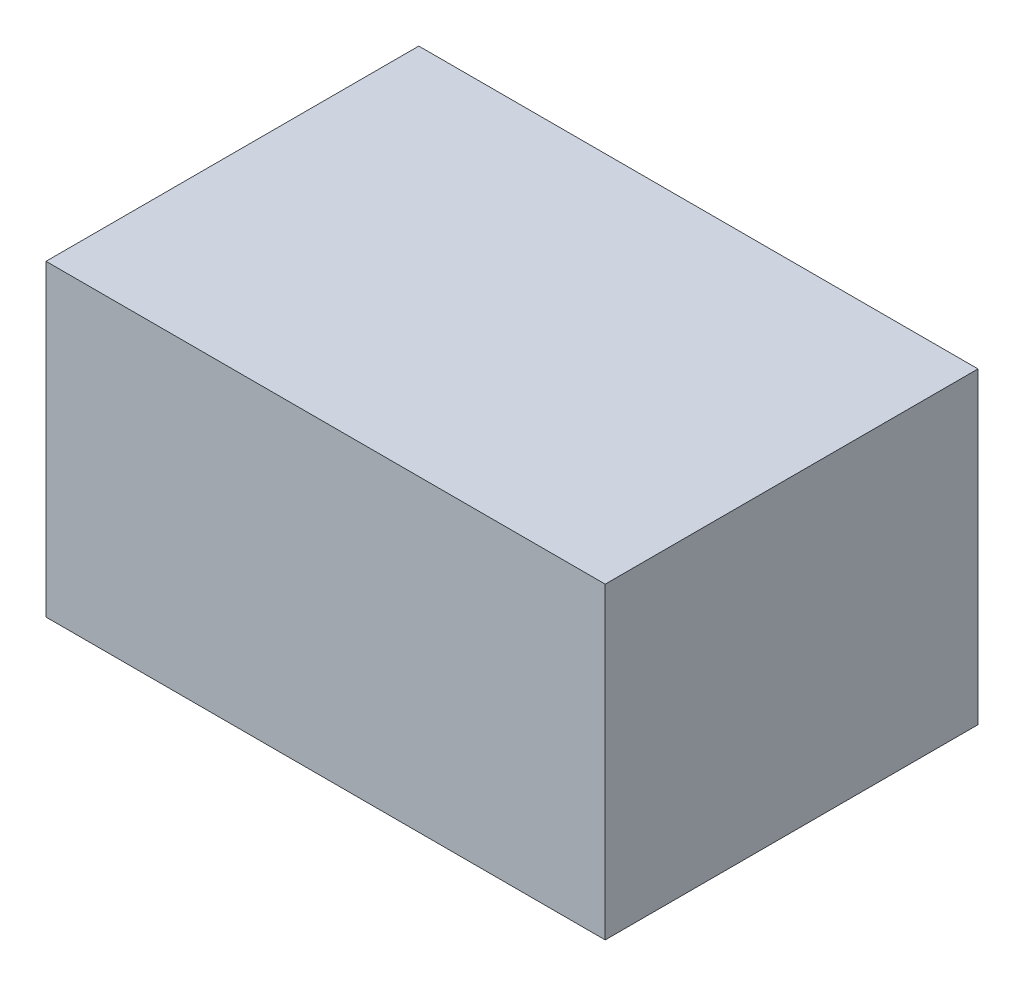
ISO-10303-21;
HEADER;
FILE_DESCRIPTION(('STEP AP214'),'2;1');
FILE_NAME('part.step','',(''),(''),'','','');
FILE_SCHEMA(('AUTOMOTIVE_DESIGN { 1 0 10303 214 1 1 1 1 }'));
ENDSEC;
DATA;
#1=APPLICATION_CONTEXT('core data for automotive mechanical design processes');
#2=APPLICATION_PROTOCOL_DEFINITION('international standard','automotive_design',2000,#1);
#3=PRODUCT_CONTEXT('',#1,'mechanical');
#4=PRODUCT('Part','Part','',(#3));
#5=PRODUCT_RELATED_PRODUCT_CATEGORY('part','',(#4));
#6=PRODUCT_DEFINITION_FORMATION('','',#4);
#7=PRODUCT_DEFINITION_CONTEXT('part definition',#1,'design');
#8=PRODUCT_DEFINITION('design','',#6,#7);
#9=PRODUCT_DEFINITION_SHAPE('','',#8);
#10=(LENGTH_UNIT() NAMED_UNIT(*) SI_UNIT(.MILLI.,.METRE.));
#11=(NAMED_UNIT(*) PLANE_ANGLE_UNIT() SI_UNIT($,.RADIAN.));
#12=(NAMED_UNIT(*) SI_UNIT($,.STERADIAN.) SOLID_ANGLE_UNIT());
#13=UNCERTAINTY_MEASURE_WITH_UNIT(LENGTH_MEASURE(1.E-05),#10,'distance_accuracy_value','');
#14=(GEOMETRIC_REPRESENTATION_CONTEXT(3) GLOBAL_UNCERTAINTY_ASSIGNED_CONTEXT((#13)) GLOBAL_UNIT_ASSIGNED_CONTEXT((#10,
#11,#12)) REPRESENTATION_CONTEXT('',''));
#15=CARTESIAN_POINT('',(0.,0.,0.));
#16=DIRECTION('',(0.,0.,1.));
#17=DIRECTION('',(1.,0.,0.));
#18=AXIS2_PLACEMENT_3D('',#15,#16,#17);
#19=CARTESIAN_POINT('',(150.,-82.6533850131725,200.));
#20=DIRECTION('',(-1.,0.,0.));
#21=DIRECTION('',(0.,0.,1.));
#22=AXIS2_PLACEMENT_3D('',#19,#20,#21);
#23=PLANE('',#22);
#24=DIRECTION('',(0.,1.,0.));
#25=VECTOR('',#24,1.);
#26=CARTESIAN_POINT('',(150.,-82.6533850131725,0.));
#27=LINE('',#26,#25);
#28=CARTESIAN_POINT('',(150.,-82.6533850131725,0.));
#29=VERTEX_POINT('',#28);
#30=CARTESIAN_POINT('',(150.,82.6533850131725,0.));
#31=VERTEX_POINT('',#30);
#32=EDGE_CURVE('E97',#29,#31,#27,.T.);
#33=ORIENTED_EDGE('',*,*,#32,.T.);
#34=DIRECTION('',(0.,0.,-1.));
#35=VECTOR('',#34,1.);
#36=CARTESIAN_POINT('',(150.,82.6533850131725,200.));
#37=LINE('',#36,#35);
#38=CARTESIAN_POINT('',(150.,82.6533850131725,200.));
#39=VERTEX_POINT('',#38);
#40=EDGE_CURVE('E11',#39,#31,#37,.T.);
#41=ORIENTED_EDGE('',*,*,#40,.F.);
#42=DIRECTION('',(0.,1.,0.));
#43=VECTOR('',#42,1.);
#44=CARTESIAN_POINT('',(150.,-82.6533850131725,200.));
#45=LINE('',#44,#43);
#46=CARTESIAN_POINT('',(150.,-82.6533850131725,200.));
#47=VERTEX_POINT('',#46);
#48=EDGE_CURVE('E85',#47,#39,#45,.T.);
#49=ORIENTED_EDGE('',*,*,#48,.F.);
#50=DIRECTION('',(0.,0.,-1.));
#51=VECTOR('',#50,1.);
#52=CARTESIAN_POINT('',(150.,-82.6533850131725,200.));
#53=LINE('',#52,#51);
#54=EDGE_CURVE('E93',#47,#29,#53,.T.);
#55=ORIENTED_EDGE('',*,*,#54,.T.);
#56=EDGE_LOOP('',(#33,#41,#49,#55));
#57=FACE_BOUND('',#56,.T.);
#58=ADVANCED_FACE('F34',(#57),#23,.F.);
#59=CARTESIAN_POINT('',(-150.,82.6533850131725,200.));
#60=DIRECTION('',(0.,-1.,0.));
#61=DIRECTION('',(0.,0.,-1.));
#62=AXIS2_PLACEMENT_3D('',#59,#60,#61);
#63=PLANE('',#62);
#64=DIRECTION('',(-1.,0.,0.));
#65=VECTOR('',#64,1.);
#66=CARTESIAN_POINT('',(-150.,82.6533850131725,0.));
#67=LINE('',#66,#65);
#68=CARTESIAN_POINT('',(-150.,82.6533850131725,0.));
#69=VERTEX_POINT('',#68);
#70=EDGE_CURVE('E89',#31,#69,#67,.T.);
#71=ORIENTED_EDGE('',*,*,#70,.T.);
#72=DIRECTION('',(0.,0.,-1.));
#73=VECTOR('',#72,1.);
#74=CARTESIAN_POINT('',(-150.,82.6533850131725,200.));
#75=LINE('',#74,#73);
#76=CARTESIAN_POINT('',(-150.,82.6533850131725,200.));
#77=VERTEX_POINT('',#76);
#78=EDGE_CURVE('E42',#77,#69,#75,.T.);
#79=ORIENTED_EDGE('',*,*,#78,.F.);
#80=DIRECTION('',(-1.,0.,0.));
#81=VECTOR('',#80,1.);
#82=CARTESIAN_POINT('',(-150.,82.6533850131725,200.));
#83=LINE('',#82,#81);
#84=EDGE_CURVE('E80',#39,#77,#83,.T.);
#85=ORIENTED_EDGE('',*,*,#84,.F.);
#86=ORIENTED_EDGE('',*,*,#40,.T.);
#87=EDGE_LOOP('',(#71,#79,#85,#86));
#88=FACE_BOUND('',#87,.T.);
#89=ADVANCED_FACE('F88',(#88),#63,.F.);
#90=CARTESIAN_POINT('',(-150.,-82.6533850131725,200.));
#91=DIRECTION('',(1.,0.,0.));
#92=DIRECTION('',(0.,0.,-1.));
#93=AXIS2_PLACEMENT_3D('',#90,#91,#92);
#94=PLANE('',#93);
#95=DIRECTION('',(0.,-1.,0.));
#96=VECTOR('',#95,1.);
#97=CARTESIAN_POINT('',(-150.,-82.6533850131725,0.));
#98=LINE('',#97,#96);
#99=CARTESIAN_POINT('',(-150.,-82.6533850131725,0.));
#100=VERTEX_POINT('',#99);
#101=EDGE_CURVE('E67',#69,#100,#98,.T.);
#102=ORIENTED_EDGE('',*,*,#101,.T.);
#103=DIRECTION('',(0.,0.,-1.));
#104=VECTOR('',#103,1.);
#105=CARTESIAN_POINT('',(-150.,-82.6533850131725,200.));
#106=LINE('',#105,#104);
#107=CARTESIAN_POINT('',(-150.,-82.6533850131725,200.));
#108=VERTEX_POINT('',#107);
#109=EDGE_CURVE('E90',#108,#100,#106,.T.);
#110=ORIENTED_EDGE('',*,*,#109,.F.);
#111=DIRECTION('',(0.,-1.,0.));
#112=VECTOR('',#111,1.);
#113=CARTESIAN_POINT('',(-150.,-82.6533850131725,200.));
#114=LINE('',#113,#112);
#115=EDGE_CURVE('E83',#77,#108,#114,.T.);
#116=ORIENTED_EDGE('',*,*,#115,.F.);
#117=ORIENTED_EDGE('',*,*,#78,.T.);
#118=EDGE_LOOP('',(#102,#110,#116,#117));
#119=FACE_BOUND('',#118,.T.);
#120=ADVANCED_FACE('F91',(#119),#94,.F.);
#121=CARTESIAN_POINT('',(-150.,-82.6533850131725,200.));
#122=DIRECTION('',(0.,1.,0.));
#123=DIRECTION('',(0.,0.,1.));
#124=AXIS2_PLACEMENT_3D('',#121,#122,#123);
#125=PLANE('',#124);
#126=DIRECTION('',(1.,0.,0.));
#127=VECTOR('',#126,1.);
#128=CARTESIAN_POINT('',(-150.,-82.6533850131725,0.));
#129=LINE('',#128,#127);
#130=EDGE_CURVE('E73',#100,#29,#129,.T.);
#131=ORIENTED_EDGE('',*,*,#130,.T.);
#132=ORIENTED_EDGE('',*,*,#54,.F.);
#133=DIRECTION('',(1.,0.,0.));
#134=VECTOR('',#133,1.);
#135=CARTESIAN_POINT('',(-150.,-82.6533850131725,200.));
#136=LINE('',#135,#134);
#137=EDGE_CURVE('E50',#108,#47,#136,.T.);
#138=ORIENTED_EDGE('',*,*,#137,.F.);
#139=ORIENTED_EDGE('',*,*,#109,.T.);
#140=EDGE_LOOP('',(#131,#132,#138,#139));
#141=FACE_BOUND('',#140,.T.);
#142=ADVANCED_FACE('F104',(#141),#125,.F.);
#143=CARTESIAN_POINT('',(0.,0.,200.));
#144=DIRECTION('',(0.,0.,-1.));
#145=DIRECTION('',(-1.,0.,0.));
#146=AXIS2_PLACEMENT_3D('',#143,#144,#145);
#147=PLANE('',#146);
#148=ORIENTED_EDGE('',*,*,#48,.T.);
#149=ORIENTED_EDGE('',*,*,#84,.T.);
#150=ORIENTED_EDGE('',*,*,#115,.T.);
#151=ORIENTED_EDGE('',*,*,#137,.T.);
#152=EDGE_LOOP('',(#148,#149,#150,#151));
#153=FACE_BOUND('',#152,.T.);
#154=ADVANCED_FACE('F81',(#153),#147,.F.);
#155=CARTESIAN_POINT('',(0.,0.,0.));
#156=DIRECTION('',(0.,0.,-1.));
#157=DIRECTION('',(-1.,0.,0.));
#158=AXIS2_PLACEMENT_3D('',#155,#156,#157);
#159=PLANE('',#158);
#160=ORIENTED_EDGE('',*,*,#32,.F.);
#161=ORIENTED_EDGE('',*,*,#130,.F.);
#162=ORIENTED_EDGE('',*,*,#101,.F.);
#163=ORIENTED_EDGE('',*,*,#70,.F.);
#164=EDGE_LOOP('',(#160,#161,#162,#163));
#165=FACE_BOUND('',#164,.T.);
#166=ADVANCED_FACE('F107',(#165),#159,.T.);
#167=CLOSED_SHELL('',(#58,#89,#120,#142,#154,#166));
#168=MANIFOLD_SOLID_BREP('B2',#167);
#169=ADVANCED_BREP_SHAPE_REPRESENTATION('',(#18,#168),#14);
#170=SHAPE_DEFINITION_REPRESENTATION(#9,#169);
ENDSEC;
END-ISO-10303-21;
